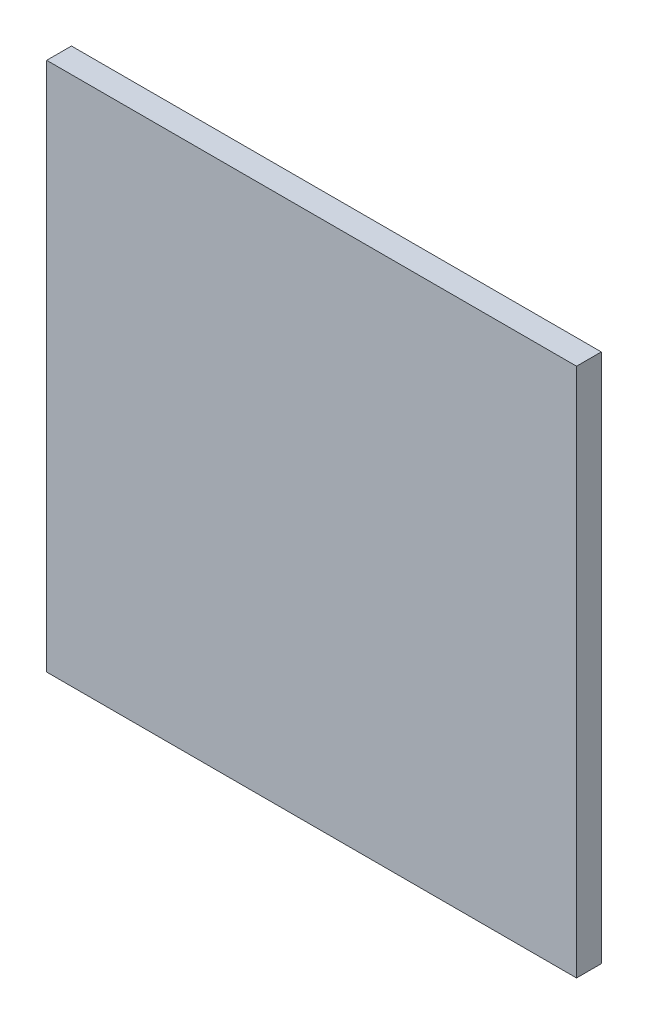
ISO-10303-21;
HEADER;
FILE_DESCRIPTION(('STEP AP214'),'2;1');
FILE_NAME('part.step','',(''),(''),'','','');
FILE_SCHEMA(('AUTOMOTIVE_DESIGN { 1 0 10303 214 1 1 1 1 }'));
ENDSEC;
DATA;
#1=APPLICATION_CONTEXT('core data for automotive mechanical design processes');
#2=APPLICATION_PROTOCOL_DEFINITION('international standard','automotive_design',2000,#1);
#3=PRODUCT_CONTEXT('',#1,'mechanical');
#4=PRODUCT('Part','Part','',(#3));
#5=PRODUCT_RELATED_PRODUCT_CATEGORY('part','',(#4));
#6=PRODUCT_DEFINITION_FORMATION('','',#4);
#7=PRODUCT_DEFINITION_CONTEXT('part definition',#1,'design');
#8=PRODUCT_DEFINITION('design','',#6,#7);
#9=PRODUCT_DEFINITION_SHAPE('','',#8);
#10=(LENGTH_UNIT() NAMED_UNIT(*) SI_UNIT(.MILLI.,.METRE.));
#11=(NAMED_UNIT(*) PLANE_ANGLE_UNIT() SI_UNIT($,.RADIAN.));
#12=(NAMED_UNIT(*) SI_UNIT($,.STERADIAN.) SOLID_ANGLE_UNIT());
#13=UNCERTAINTY_MEASURE_WITH_UNIT(LENGTH_MEASURE(1.E-05),#10,'distance_accuracy_value','');
#14=(GEOMETRIC_REPRESENTATION_CONTEXT(3) GLOBAL_UNCERTAINTY_ASSIGNED_CONTEXT((#13)) GLOBAL_UNIT_ASSIGNED_CONTEXT((#10,
#11,#12)) REPRESENTATION_CONTEXT('',''));
#15=CARTESIAN_POINT('',(0.,0.,0.));
#16=DIRECTION('',(0.,0.,1.));
#17=DIRECTION('',(1.,0.,0.));
#18=AXIS2_PLACEMENT_3D('',#15,#16,#17);
#19=CARTESIAN_POINT('',(-267.5,267.5,25.));
#20=DIRECTION('',(1.,0.,0.));
#21=DIRECTION('',(0.,0.,-1.));
#22=AXIS2_PLACEMENT_3D('',#19,#20,#21);
#23=PLANE('',#22);
#24=DIRECTION('',(0.,-1.,0.));
#25=VECTOR('',#24,1.);
#26=CARTESIAN_POINT('',(-267.5,267.5,0.));
#27=LINE('',#26,#25);
#28=CARTESIAN_POINT('',(-267.5,267.5,0.));
#29=VERTEX_POINT('',#28);
#30=CARTESIAN_POINT('',(-267.5,-267.5,0.));
#31=VERTEX_POINT('',#30);
#32=EDGE_CURVE('E100',#29,#31,#27,.T.);
#33=ORIENTED_EDGE('',*,*,#32,.T.);
#34=DIRECTION('',(0.,0.,-1.));
#35=VECTOR('',#34,1.);
#36=CARTESIAN_POINT('',(-267.5,-267.5,25.));
#37=LINE('',#36,#35);
#38=CARTESIAN_POINT('',(-267.5,-267.5,25.));
#39=VERTEX_POINT('',#38);
#40=EDGE_CURVE('E11',#39,#31,#37,.T.);
#41=ORIENTED_EDGE('',*,*,#40,.F.);
#42=DIRECTION('',(0.,-1.,0.));
#43=VECTOR('',#42,1.);
#44=CARTESIAN_POINT('',(-267.5,267.5,25.));
#45=LINE('',#44,#43);
#46=CARTESIAN_POINT('',(-267.5,267.5,25.));
#47=VERTEX_POINT('',#46);
#48=EDGE_CURVE('E88',#47,#39,#45,.T.);
#49=ORIENTED_EDGE('',*,*,#48,.F.);
#50=DIRECTION('',(0.,0.,-1.));
#51=VECTOR('',#50,1.);
#52=CARTESIAN_POINT('',(-267.5,267.5,25.));
#53=LINE('',#52,#51);
#54=EDGE_CURVE('E96',#47,#29,#53,.T.);
#55=ORIENTED_EDGE('',*,*,#54,.T.);
#56=EDGE_LOOP('',(#33,#41,#49,#55));
#57=FACE_BOUND('',#56,.T.);
#58=ADVANCED_FACE('F37',(#57),#23,.F.);
#59=CARTESIAN_POINT('',(267.5,-267.5,25.));
#60=DIRECTION('',(0.,1.,0.));
#61=DIRECTION('',(-1.,0.,0.));
#62=AXIS2_PLACEMENT_3D('',#59,#60,#61);
#63=PLANE('',#62);
#64=DIRECTION('',(1.,0.,0.));
#65=VECTOR('',#64,1.);
#66=CARTESIAN_POINT('',(267.5,-267.5,0.));
#67=LINE('',#66,#65);
#68=CARTESIAN_POINT('',(267.5,-267.5,0.));
#69=VERTEX_POINT('',#68);
#70=EDGE_CURVE('E92',#31,#69,#67,.T.);
#71=ORIENTED_EDGE('',*,*,#70,.T.);
#72=DIRECTION('',(0.,0.,-1.));
#73=VECTOR('',#72,1.);
#74=CARTESIAN_POINT('',(267.5,-267.5,25.));
#75=LINE('',#74,#73);
#76=CARTESIAN_POINT('',(267.5,-267.5,25.));
#77=VERTEX_POINT('',#76);
#78=EDGE_CURVE('E45',#77,#69,#75,.T.);
#79=ORIENTED_EDGE('',*,*,#78,.F.);
#80=DIRECTION('',(1.,0.,0.));
#81=VECTOR('',#80,1.);
#82=CARTESIAN_POINT('',(267.5,-267.5,25.));
#83=LINE('',#82,#81);
#84=EDGE_CURVE('E83',#39,#77,#83,.T.);
#85=ORIENTED_EDGE('',*,*,#84,.F.);
#86=ORIENTED_EDGE('',*,*,#40,.T.);
#87=EDGE_LOOP('',(#71,#79,#85,#86));
#88=FACE_BOUND('',#87,.T.);
#89=ADVANCED_FACE('F91',(#88),#63,.F.);
#90=CARTESIAN_POINT('',(267.5,267.5,25.));
#91=DIRECTION('',(-1.,0.,0.));
#92=DIRECTION('',(0.,0.,1.));
#93=AXIS2_PLACEMENT_3D('',#90,#91,#92);
#94=PLANE('',#93);
#95=DIRECTION('',(0.,1.,0.));
#96=VECTOR('',#95,1.);
#97=CARTESIAN_POINT('',(267.5,267.5,0.));
#98=LINE('',#97,#96);
#99=CARTESIAN_POINT('',(267.5,267.5,0.));
#100=VERTEX_POINT('',#99);
#101=EDGE_CURVE('E70',#69,#100,#98,.T.);
#102=ORIENTED_EDGE('',*,*,#101,.T.);
#103=DIRECTION('',(0.,0.,-1.));
#104=VECTOR('',#103,1.);
#105=CARTESIAN_POINT('',(267.5,267.5,25.));
#106=LINE('',#105,#104);
#107=CARTESIAN_POINT('',(267.5,267.5,25.));
#108=VERTEX_POINT('',#107);
#109=EDGE_CURVE('E93',#108,#100,#106,.T.);
#110=ORIENTED_EDGE('',*,*,#109,.F.);
#111=DIRECTION('',(0.,1.,0.));
#112=VECTOR('',#111,1.);
#113=CARTESIAN_POINT('',(267.5,267.5,25.));
#114=LINE('',#113,#112);
#115=EDGE_CURVE('E86',#77,#108,#114,.T.);
#116=ORIENTED_EDGE('',*,*,#115,.F.);
#117=ORIENTED_EDGE('',*,*,#78,.T.);
#118=EDGE_LOOP('',(#102,#110,#116,#117));
#119=FACE_BOUND('',#118,.T.);
#120=ADVANCED_FACE('F94',(#119),#94,.F.);
#121=CARTESIAN_POINT('',(267.5,267.5,25.));
#122=DIRECTION('',(0.,-1.,0.));
#123=DIRECTION('',(1.,0.,0.));
#124=AXIS2_PLACEMENT_3D('',#121,#122,#123);
#125=PLANE('',#124);
#126=DIRECTION('',(-1.,0.,0.));
#127=VECTOR('',#126,1.);
#128=CARTESIAN_POINT('',(267.5,267.5,0.));
#129=LINE('',#128,#127);
#130=EDGE_CURVE('E76',#100,#29,#129,.T.);
#131=ORIENTED_EDGE('',*,*,#130,.T.);
#132=ORIENTED_EDGE('',*,*,#54,.F.);
#133=DIRECTION('',(-1.,0.,0.));
#134=VECTOR('',#133,1.);
#135=CARTESIAN_POINT('',(267.5,267.5,25.));
#136=LINE('',#135,#134);
#137=EDGE_CURVE('E53',#108,#47,#136,.T.);
#138=ORIENTED_EDGE('',*,*,#137,.F.);
#139=ORIENTED_EDGE('',*,*,#109,.T.);
#140=EDGE_LOOP('',(#131,#132,#138,#139));
#141=FACE_BOUND('',#140,.T.);
#142=ADVANCED_FACE('F107',(#141),#125,.F.);
#143=CARTESIAN_POINT('',(0.,0.,25.));
#144=DIRECTION('',(0.,0.,-1.));
#145=DIRECTION('',(-1.,0.,0.));
#146=AXIS2_PLACEMENT_3D('',#143,#144,#145);
#147=PLANE('',#146);
#148=ORIENTED_EDGE('',*,*,#48,.T.);
#149=ORIENTED_EDGE('',*,*,#84,.T.);
#150=ORIENTED_EDGE('',*,*,#115,.T.);
#151=ORIENTED_EDGE('',*,*,#137,.T.);
#152=EDGE_LOOP('',(#148,#149,#150,#151));
#153=FACE_BOUND('',#152,.T.);
#154=ADVANCED_FACE('F84',(#153),#147,.F.);
#155=CARTESIAN_POINT('',(0.,0.,0.));
#156=DIRECTION('',(0.,0.,-1.));
#157=DIRECTION('',(-1.,0.,0.));
#158=AXIS2_PLACEMENT_3D('',#155,#156,#157);
#159=PLANE('',#158);
#160=ORIENTED_EDGE('',*,*,#32,.F.);
#161=ORIENTED_EDGE('',*,*,#130,.F.);
#162=ORIENTED_EDGE('',*,*,#101,.F.);
#163=ORIENTED_EDGE('',*,*,#70,.F.);
#164=EDGE_LOOP('',(#160,#161,#162,#163));
#165=FACE_BOUND('',#164,.T.);
#166=ADVANCED_FACE('F110',(#165),#159,.T.);
#167=CLOSED_SHELL('',(#58,#89,#120,#142,#154,#166));
#168=MANIFOLD_SOLID_BREP('B2',#167);
#169=ADVANCED_BREP_SHAPE_REPRESENTATION('',(#18,#168),#14);
#170=SHAPE_DEFINITION_REPRESENTATION(#9,#169);
ENDSEC;
END-ISO-10303-21;
